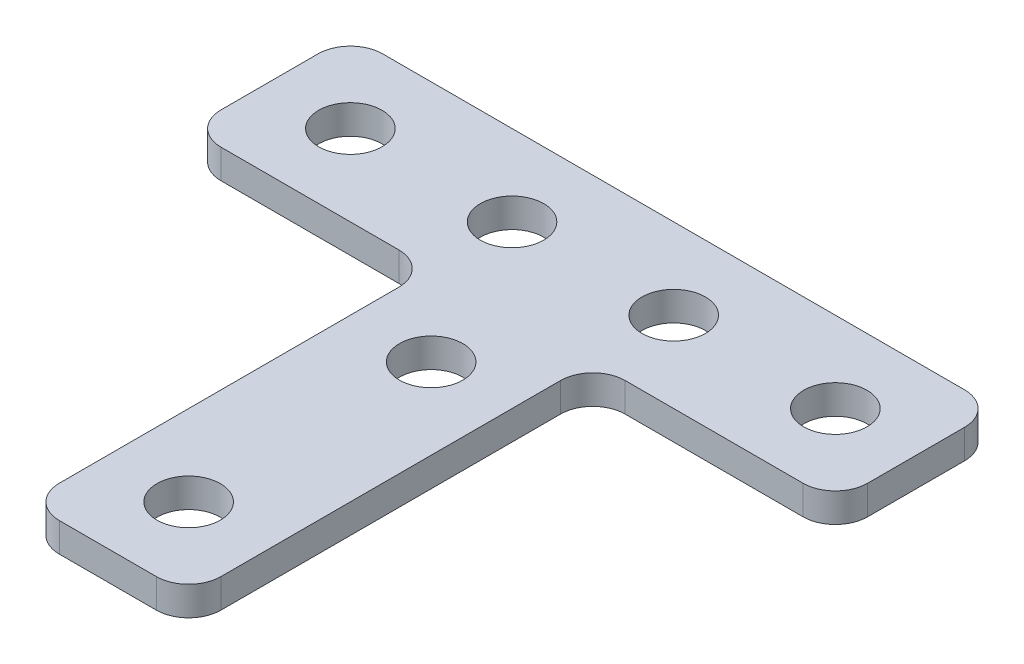
ISO-10303-21;
HEADER;
FILE_DESCRIPTION(('STEP AP214'),'2;1');
FILE_NAME('part.step','',(''),(''),'','','');
FILE_SCHEMA(('AUTOMOTIVE_DESIGN { 1 0 10303 214 1 1 1 1 }'));
ENDSEC;
DATA;
#1=APPLICATION_CONTEXT('core data for automotive mechanical design processes');
#2=APPLICATION_PROTOCOL_DEFINITION('international standard','automotive_design',2000,#1);
#3=PRODUCT_CONTEXT('',#1,'mechanical');
#4=PRODUCT('Part','Part','',(#3));
#5=PRODUCT_RELATED_PRODUCT_CATEGORY('part','',(#4));
#6=PRODUCT_DEFINITION_FORMATION('','',#4);
#7=PRODUCT_DEFINITION_CONTEXT('part definition',#1,'design');
#8=PRODUCT_DEFINITION('design','',#6,#7);
#9=PRODUCT_DEFINITION_SHAPE('','',#8);
#10=(LENGTH_UNIT() NAMED_UNIT(*) SI_UNIT(.MILLI.,.METRE.));
#11=(NAMED_UNIT(*) PLANE_ANGLE_UNIT() SI_UNIT($,.RADIAN.));
#12=(NAMED_UNIT(*) SI_UNIT($,.STERADIAN.) SOLID_ANGLE_UNIT());
#13=UNCERTAINTY_MEASURE_WITH_UNIT(LENGTH_MEASURE(1.E-05),#10,'distance_accuracy_value','');
#14=(GEOMETRIC_REPRESENTATION_CONTEXT(3) GLOBAL_UNCERTAINTY_ASSIGNED_CONTEXT((#13)) GLOBAL_UNIT_ASSIGNED_CONTEXT((#10,
#11,#12)) REPRESENTATION_CONTEXT('',''));
#15=CARTESIAN_POINT('',(0.,0.,0.));
#16=DIRECTION('',(0.,0.,1.));
#17=DIRECTION('',(1.,0.,0.));
#18=AXIS2_PLACEMENT_3D('',#15,#16,#17);
#19=CARTESIAN_POINT('',(0.,2.286,-31.75));
#20=DIRECTION('',(0.,0.,-1.));
#21=DIRECTION('',(-1.,0.,0.));
#22=AXIS2_PLACEMENT_3D('',#19,#20,#21);
#23=PLANE('',#22);
#24=DIRECTION('',(1.,0.,0.));
#25=VECTOR('',#24,1.);
#26=CARTESIAN_POINT('',(0.,2.286,-31.75));
#27=LINE('',#26,#25);
#28=CARTESIAN_POINT('',(-16.5071004340156,2.286,-31.75));
#29=VERTEX_POINT('',#28);
#30=CARTESIAN_POINT('',(-2.54,2.286,-31.75));
#31=VERTEX_POINT('',#30);
#32=EDGE_CURVE('E280',#29,#31,#27,.T.);
#33=ORIENTED_EDGE('',*,*,#32,.F.);
#34=DIRECTION('',(0.,-1.,0.));
#35=VECTOR('',#34,1.);
#36=CARTESIAN_POINT('',(-16.5071004340156,0.,-31.75));
#37=LINE('',#36,#35);
#38=CARTESIAN_POINT('',(-16.5071004340156,0.,-31.75));
#39=VERTEX_POINT('',#38);
#40=EDGE_CURVE('E222',#29,#39,#37,.T.);
#41=ORIENTED_EDGE('',*,*,#40,.T.);
#42=DIRECTION('',(1.,0.,0.));
#43=VECTOR('',#42,1.);
#44=CARTESIAN_POINT('',(0.,0.,-31.75));
#45=LINE('',#44,#43);
#46=CARTESIAN_POINT('',(-2.54,0.,-31.75));
#47=VERTEX_POINT('',#46);
#48=EDGE_CURVE('E165',#39,#47,#45,.T.);
#49=ORIENTED_EDGE('',*,*,#48,.T.);
#50=DIRECTION('',(0.,-1.,0.));
#51=VECTOR('',#50,1.);
#52=CARTESIAN_POINT('',(-2.54,2.286,-31.75));
#53=LINE('',#52,#51);
#54=EDGE_CURVE('E220',#47,#31,#53,.F.);
#55=ORIENTED_EDGE('',*,*,#54,.T.);
#56=EDGE_LOOP('',(#33,#41,#49,#55));
#57=FACE_BOUND('',#56,.T.);
#58=ADVANCED_FACE('F45',(#57),#23,.F.);
#59=CARTESIAN_POINT('',(0.,2.286,0.));
#60=DIRECTION('',(-1.,0.,0.));
#61=DIRECTION('',(0.,0.,1.));
#62=AXIS2_PLACEMENT_3D('',#59,#60,#61);
#63=PLANE('',#62);
#64=DIRECTION('',(0.,0.,-1.));
#65=VECTOR('',#64,1.);
#66=CARTESIAN_POINT('',(0.,2.286,0.));
#67=LINE('',#66,#65);
#68=CARTESIAN_POINT('',(0.,2.286,-2.54));
#69=VERTEX_POINT('',#68);
#70=CARTESIAN_POINT('',(0.,2.286,-29.21));
#71=VERTEX_POINT('',#70);
#72=EDGE_CURVE('E288',#69,#71,#67,.T.);
#73=ORIENTED_EDGE('',*,*,#72,.T.);
#74=DIRECTION('',(0.,-1.,0.));
#75=VECTOR('',#74,1.);
#76=CARTESIAN_POINT('',(0.,2.286,-29.21));
#77=LINE('',#76,#75);
#78=CARTESIAN_POINT('',(0.,0.,-29.21));
#79=VERTEX_POINT('',#78);
#80=EDGE_CURVE('E226',#71,#79,#77,.T.);
#81=ORIENTED_EDGE('',*,*,#80,.T.);
#82=DIRECTION('',(0.,0.,-1.));
#83=VECTOR('',#82,1.);
#84=CARTESIAN_POINT('',(0.,0.,0.));
#85=LINE('',#84,#83);
#86=CARTESIAN_POINT('',(0.,0.,-2.54));
#87=VERTEX_POINT('',#86);
#88=EDGE_CURVE('E319',#87,#79,#85,.T.);
#89=ORIENTED_EDGE('',*,*,#88,.F.);
#90=DIRECTION('',(0.,-1.,0.));
#91=VECTOR('',#90,1.);
#92=CARTESIAN_POINT('',(0.,2.286,-2.54));
#93=LINE('',#92,#91);
#94=EDGE_CURVE('E224',#87,#69,#93,.F.);
#95=ORIENTED_EDGE('',*,*,#94,.T.);
#96=EDGE_LOOP('',(#73,#81,#89,#95));
#97=FACE_BOUND('',#96,.T.);
#98=ADVANCED_FACE('F357',(#97),#63,.T.);
#99=CARTESIAN_POINT('',(0.,2.286,0.));
#100=DIRECTION('',(0.,0.,-1.));
#101=DIRECTION('',(-1.,0.,0.));
#102=AXIS2_PLACEMENT_3D('',#99,#100,#101);
#103=PLANE('',#102);
#104=DIRECTION('',(1.,0.,0.));
#105=VECTOR('',#104,1.);
#106=CARTESIAN_POINT('',(0.,2.286,0.));
#107=LINE('',#106,#105);
#108=CARTESIAN_POINT('',(2.54,2.286,0.));
#109=VERTEX_POINT('',#108);
#110=CARTESIAN_POINT('',(10.16,2.286,0.));
#111=VERTEX_POINT('',#110);
#112=EDGE_CURVE('E283',#109,#111,#107,.T.);
#113=ORIENTED_EDGE('',*,*,#112,.F.);
#114=DIRECTION('',(0.,-1.,0.));
#115=VECTOR('',#114,1.);
#116=CARTESIAN_POINT('',(2.54,0.,0.));
#117=LINE('',#116,#115);
#118=CARTESIAN_POINT('',(2.54,0.,0.));
#119=VERTEX_POINT('',#118);
#120=EDGE_CURVE('E245',#109,#119,#117,.T.);
#121=ORIENTED_EDGE('',*,*,#120,.T.);
#122=DIRECTION('',(1.,0.,0.));
#123=VECTOR('',#122,1.);
#124=CARTESIAN_POINT('',(0.,0.,0.));
#125=LINE('',#124,#123);
#126=CARTESIAN_POINT('',(10.16,0.,0.));
#127=VERTEX_POINT('',#126);
#128=EDGE_CURVE('E265',#119,#127,#125,.T.);
#129=ORIENTED_EDGE('',*,*,#128,.T.);
#130=DIRECTION('',(0.,-1.,0.));
#131=VECTOR('',#130,1.);
#132=CARTESIAN_POINT('',(10.16,2.286,0.));
#133=LINE('',#132,#131);
#134=EDGE_CURVE('E243',#127,#111,#133,.F.);
#135=ORIENTED_EDGE('',*,*,#134,.T.);
#136=EDGE_LOOP('',(#113,#121,#129,#135));
#137=FACE_BOUND('',#136,.T.);
#138=ADVANCED_FACE('F351',(#137),#103,.F.);
#139=CARTESIAN_POINT('',(12.7,2.286,0.));
#140=DIRECTION('',(-1.,0.,0.));
#141=DIRECTION('',(0.,0.,1.));
#142=AXIS2_PLACEMENT_3D('',#139,#140,#141);
#143=PLANE('',#142);
#144=DIRECTION('',(0.,0.,-1.));
#145=VECTOR('',#144,1.);
#146=CARTESIAN_POINT('',(12.7,0.,0.));
#147=LINE('',#146,#145);
#148=CARTESIAN_POINT('',(12.7,0.,-2.54));
#149=VERTEX_POINT('',#148);
#150=CARTESIAN_POINT('',(12.7,0.,-29.21));
#151=VERTEX_POINT('',#150);
#152=EDGE_CURVE('E254',#149,#151,#147,.T.);
#153=ORIENTED_EDGE('',*,*,#152,.T.);
#154=DIRECTION('',(0.,-1.,0.));
#155=VECTOR('',#154,1.);
#156=CARTESIAN_POINT('',(12.7,2.286,-29.21));
#157=LINE('',#156,#155);
#158=CARTESIAN_POINT('',(12.7,2.286,-29.21));
#159=VERTEX_POINT('',#158);
#160=EDGE_CURVE('E241',#151,#159,#157,.F.);
#161=ORIENTED_EDGE('',*,*,#160,.T.);
#162=DIRECTION('',(0.,0.,-1.));
#163=VECTOR('',#162,1.);
#164=CARTESIAN_POINT('',(12.7,2.286,0.));
#165=LINE('',#164,#163);
#166=CARTESIAN_POINT('',(12.7,2.286,-2.54));
#167=VERTEX_POINT('',#166);
#168=EDGE_CURVE('E274',#167,#159,#165,.T.);
#169=ORIENTED_EDGE('',*,*,#168,.F.);
#170=DIRECTION('',(0.,-1.,0.));
#171=VECTOR('',#170,1.);
#172=CARTESIAN_POINT('',(12.7,2.286,-2.54));
#173=LINE('',#172,#171);
#174=EDGE_CURVE('E238',#167,#149,#173,.T.);
#175=ORIENTED_EDGE('',*,*,#174,.T.);
#176=EDGE_LOOP('',(#153,#161,#169,#175));
#177=FACE_BOUND('',#176,.T.);
#178=ADVANCED_FACE('F261',(#177),#143,.F.);
#179=CARTESIAN_POINT('',(15.24,0.,-31.75));
#180=VERTEX_POINT('',#179);
#181=CARTESIAN_POINT('',(29.21,0.,-31.75));
#182=VERTEX_POINT('',#181);
#183=EDGE_CURVE('E256',#180,#182,#45,.T.);
#184=ORIENTED_EDGE('',*,*,#183,.T.);
#185=DIRECTION('',(0.,-1.,0.));
#186=VECTOR('',#185,1.);
#187=CARTESIAN_POINT('',(29.21,2.286,-31.75));
#188=LINE('',#187,#186);
#189=CARTESIAN_POINT('',(29.21,2.286,-31.75));
#190=VERTEX_POINT('',#189);
#191=EDGE_CURVE('E236',#182,#190,#188,.F.);
#192=ORIENTED_EDGE('',*,*,#191,.T.);
#193=CARTESIAN_POINT('',(15.24,2.286,-31.75));
#194=VERTEX_POINT('',#193);
#195=EDGE_CURVE('E273',#194,#190,#27,.T.);
#196=ORIENTED_EDGE('',*,*,#195,.F.);
#197=DIRECTION('',(0.,-1.,0.));
#198=VECTOR('',#197,1.);
#199=CARTESIAN_POINT('',(15.24,0.,-31.75));
#200=LINE('',#199,#198);
#201=EDGE_CURVE('E233',#194,#180,#200,.T.);
#202=ORIENTED_EDGE('',*,*,#201,.T.);
#203=EDGE_LOOP('',(#184,#192,#196,#202));
#204=FACE_BOUND('',#203,.T.);
#205=ADVANCED_FACE('F276',(#204),#23,.F.);
#206=CARTESIAN_POINT('',(31.75,2.286,0.));
#207=DIRECTION('',(-1.,0.,0.));
#208=DIRECTION('',(0.,0.,1.));
#209=AXIS2_PLACEMENT_3D('',#206,#207,#208);
#210=PLANE('',#209);
#211=DIRECTION('',(0.,0.,-1.));
#212=VECTOR('',#211,1.);
#213=CARTESIAN_POINT('',(31.75,0.,0.));
#214=LINE('',#213,#212);
#215=CARTESIAN_POINT('',(31.75,0.,-34.29));
#216=VERTEX_POINT('',#215);
#217=CARTESIAN_POINT('',(31.75,0.,-41.91));
#218=VERTEX_POINT('',#217);
#219=EDGE_CURVE('E315',#216,#218,#214,.T.);
#220=ORIENTED_EDGE('',*,*,#219,.T.);
#221=DIRECTION('',(0.,-1.,0.));
#222=VECTOR('',#221,1.);
#223=CARTESIAN_POINT('',(31.75,2.286,-41.91));
#224=LINE('',#223,#222);
#225=CARTESIAN_POINT('',(31.75,2.286,-41.91));
#226=VERTEX_POINT('',#225);
#227=EDGE_CURVE('E60',#218,#226,#224,.F.);
#228=ORIENTED_EDGE('',*,*,#227,.T.);
#229=DIRECTION('',(0.,0.,-1.));
#230=VECTOR('',#229,1.);
#231=CARTESIAN_POINT('',(31.75,2.286,0.));
#232=LINE('',#231,#230);
#233=CARTESIAN_POINT('',(31.75,2.286,-34.29));
#234=VERTEX_POINT('',#233);
#235=EDGE_CURVE('E278',#234,#226,#232,.T.);
#236=ORIENTED_EDGE('',*,*,#235,.F.);
#237=DIRECTION('',(0.,-1.,0.));
#238=VECTOR('',#237,1.);
#239=CARTESIAN_POINT('',(31.75,2.286,-34.29));
#240=LINE('',#239,#238);
#241=EDGE_CURVE('E229',#234,#216,#240,.T.);
#242=ORIENTED_EDGE('',*,*,#241,.T.);
#243=EDGE_LOOP('',(#220,#228,#236,#242));
#244=FACE_BOUND('',#243,.T.);
#245=ADVANCED_FACE('F373',(#244),#210,.F.);
#246=CARTESIAN_POINT('',(0.,2.286,-44.45));
#247=DIRECTION('',(0.,0.,-1.));
#248=DIRECTION('',(-1.,0.,0.));
#249=AXIS2_PLACEMENT_3D('',#246,#247,#248);
#250=PLANE('',#249);
#251=DIRECTION('',(1.,0.,0.));
#252=VECTOR('',#251,1.);
#253=CARTESIAN_POINT('',(0.,0.,-44.45));
#254=LINE('',#253,#252);
#255=CARTESIAN_POINT('',(-16.5071004340156,0.,-44.45));
#256=VERTEX_POINT('',#255);
#257=CARTESIAN_POINT('',(29.21,0.,-44.45));
#258=VERTEX_POINT('',#257);
#259=EDGE_CURVE('E182',#256,#258,#254,.T.);
#260=ORIENTED_EDGE('',*,*,#259,.F.);
#261=DIRECTION('',(0.,-1.,0.));
#262=VECTOR('',#261,1.);
#263=CARTESIAN_POINT('',(-16.5071004340156,2.286,-44.45));
#264=LINE('',#263,#262);
#265=CARTESIAN_POINT('',(-16.5071004340156,2.286,-44.45));
#266=VERTEX_POINT('',#265);
#267=EDGE_CURVE('E208',#256,#266,#264,.F.);
#268=ORIENTED_EDGE('',*,*,#267,.T.);
#269=DIRECTION('',(1.,0.,0.));
#270=VECTOR('',#269,1.);
#271=CARTESIAN_POINT('',(0.,2.286,-44.45));
#272=LINE('',#271,#270);
#273=CARTESIAN_POINT('',(29.21,2.286,-44.45));
#274=VERTEX_POINT('',#273);
#275=EDGE_CURVE('E281',#266,#274,#272,.T.);
#276=ORIENTED_EDGE('',*,*,#275,.T.);
#277=DIRECTION('',(0.,-1.,0.));
#278=VECTOR('',#277,1.);
#279=CARTESIAN_POINT('',(29.21,0.,-44.45));
#280=LINE('',#279,#278);
#281=EDGE_CURVE('E205',#274,#258,#280,.T.);
#282=ORIENTED_EDGE('',*,*,#281,.T.);
#283=EDGE_LOOP('',(#260,#268,#276,#282));
#284=FACE_BOUND('',#283,.T.);
#285=ADVANCED_FACE('F378',(#284),#250,.T.);
#286=CARTESIAN_POINT('',(6.35,2.286,-25.4));
#287=DIRECTION('',(0.,-1.,0.));
#288=DIRECTION('',(0.,0.,-1.));
#289=AXIS2_PLACEMENT_3D('',#286,#287,#288);
#290=CYLINDRICAL_SURFACE('',#289,2.4892);
#291=CARTESIAN_POINT('',(6.35,2.286,-25.4));
#292=DIRECTION('',(0.,1.,0.));
#293=DIRECTION('',(0.,0.,1.));
#294=AXIS2_PLACEMENT_3D('',#291,#292,#293);
#295=CIRCLE('',#294,2.4892);
#296=CARTESIAN_POINT('',(6.35,2.286,-22.9108));
#297=VERTEX_POINT('',#296);
#298=EDGE_CURVE('E192',#297,#297,#295,.T.);
#299=ORIENTED_EDGE('',*,*,#298,.T.);
#300=EDGE_LOOP('',(#299));
#301=FACE_BOUND('',#300,.T.);
#302=CARTESIAN_POINT('',(6.35,0.,-25.4));
#303=DIRECTION('',(0.,1.,0.));
#304=DIRECTION('',(0.,0.,1.));
#305=AXIS2_PLACEMENT_3D('',#302,#303,#304);
#306=CIRCLE('',#305,2.4892);
#307=CARTESIAN_POINT('',(6.35,0.,-22.9108));
#308=VERTEX_POINT('',#307);
#309=EDGE_CURVE('E181',#308,#308,#306,.T.);
#310=ORIENTED_EDGE('',*,*,#309,.F.);
#311=EDGE_LOOP('',(#310));
#312=FACE_BOUND('',#311,.T.);
#313=ADVANCED_FACE('F489',(#301,#312),#290,.F.);
#314=CARTESIAN_POINT('',(-19.0471004340156,2.286,0.));
#315=DIRECTION('',(-1.,0.,0.));
#316=DIRECTION('',(0.,0.,1.));
#317=AXIS2_PLACEMENT_3D('',#314,#315,#316);
#318=PLANE('',#317);
#319=DIRECTION('',(0.,0.,-1.));
#320=VECTOR('',#319,1.);
#321=CARTESIAN_POINT('',(-19.0471004340156,2.286,0.));
#322=LINE('',#321,#320);
#323=CARTESIAN_POINT('',(-19.0471004340156,2.286,-34.29));
#324=VERTEX_POINT('',#323);
#325=CARTESIAN_POINT('',(-19.0471004340156,2.286,-41.91));
#326=VERTEX_POINT('',#325);
#327=EDGE_CURVE('E337',#324,#326,#322,.T.);
#328=ORIENTED_EDGE('',*,*,#327,.T.);
#329=DIRECTION('',(0.,-1.,0.));
#330=VECTOR('',#329,1.);
#331=CARTESIAN_POINT('',(-19.0471004340156,2.286,-41.91));
#332=LINE('',#331,#330);
#333=CARTESIAN_POINT('',(-19.0471004340156,0.,-41.91));
#334=VERTEX_POINT('',#333);
#335=EDGE_CURVE('E180',#326,#334,#332,.T.);
#336=ORIENTED_EDGE('',*,*,#335,.T.);
#337=DIRECTION('',(0.,0.,-1.));
#338=VECTOR('',#337,1.);
#339=CARTESIAN_POINT('',(-19.0471004340156,0.,0.));
#340=LINE('',#339,#338);
#341=CARTESIAN_POINT('',(-19.0471004340156,0.,-34.29));
#342=VERTEX_POINT('',#341);
#343=EDGE_CURVE('E163',#342,#334,#340,.T.);
#344=ORIENTED_EDGE('',*,*,#343,.F.);
#345=DIRECTION('',(0.,-1.,0.));
#346=VECTOR('',#345,1.);
#347=CARTESIAN_POINT('',(-19.0471004340156,2.286,-34.29));
#348=LINE('',#347,#346);
#349=EDGE_CURVE('E177',#342,#324,#348,.F.);
#350=ORIENTED_EDGE('',*,*,#349,.T.);
#351=EDGE_LOOP('',(#328,#336,#344,#350));
#352=FACE_BOUND('',#351,.T.);
#353=ADVANCED_FACE('F176',(#352),#318,.T.);
#354=CARTESIAN_POINT('',(0.00289956598443879,2.286,-38.1));
#355=DIRECTION('',(0.,-1.,0.));
#356=DIRECTION('',(0.,0.,-1.));
#357=AXIS2_PLACEMENT_3D('',#354,#355,#356);
#358=CYLINDRICAL_SURFACE('',#357,2.48920000000001);
#359=CARTESIAN_POINT('',(0.00289956598443879,2.286,-38.1));
#360=DIRECTION('',(0.,1.,0.));
#361=DIRECTION('',(0.,0.,1.));
#362=AXIS2_PLACEMENT_3D('',#359,#360,#361);
#363=CIRCLE('',#362,2.48920000000001);
#364=CARTESIAN_POINT('',(0.00289956598443879,2.286,-35.6108));
#365=VERTEX_POINT('',#364);
#366=EDGE_CURVE('E289',#365,#365,#363,.T.);
#367=ORIENTED_EDGE('',*,*,#366,.T.);
#368=EDGE_LOOP('',(#367));
#369=FACE_BOUND('',#368,.T.);
#370=CARTESIAN_POINT('',(0.00289956598443879,0.,-38.1));
#371=DIRECTION('',(0.,1.,0.));
#372=DIRECTION('',(0.,0.,1.));
#373=AXIS2_PLACEMENT_3D('',#370,#371,#372);
#374=CIRCLE('',#373,2.48920000000001);
#375=CARTESIAN_POINT('',(0.00289956598443879,0.,-35.6108));
#376=VERTEX_POINT('',#375);
#377=EDGE_CURVE('E323',#376,#376,#374,.T.);
#378=ORIENTED_EDGE('',*,*,#377,.F.);
#379=EDGE_LOOP('',(#378));
#380=FACE_BOUND('',#379,.T.);
#381=ADVANCED_FACE('F384',(#369,#380),#358,.F.);
#382=CARTESIAN_POINT('',(12.7028995659844,2.286,-38.0999999999997));
#383=DIRECTION('',(0.,-1.,0.));
#384=DIRECTION('',(0.,0.,-1.));
#385=AXIS2_PLACEMENT_3D('',#382,#383,#384);
#386=CYLINDRICAL_SURFACE('',#385,2.4892);
#387=CARTESIAN_POINT('',(12.7028995659844,2.286,-38.0999999999997));
#388=DIRECTION('',(0.,1.,0.));
#389=DIRECTION('',(0.,0.,1.));
#390=AXIS2_PLACEMENT_3D('',#387,#388,#389);
#391=CIRCLE('',#390,2.4892);
#392=CARTESIAN_POINT('',(12.7028995659844,2.286,-35.6107999999997));
#393=VERTEX_POINT('',#392);
#394=EDGE_CURVE('E294',#393,#393,#391,.T.);
#395=ORIENTED_EDGE('',*,*,#394,.T.);
#396=EDGE_LOOP('',(#395));
#397=FACE_BOUND('',#396,.T.);
#398=CARTESIAN_POINT('',(12.7028995659844,0.,-38.0999999999997));
#399=DIRECTION('',(0.,1.,0.));
#400=DIRECTION('',(0.,0.,1.));
#401=AXIS2_PLACEMENT_3D('',#398,#399,#400);
#402=CIRCLE('',#401,2.4892);
#403=CARTESIAN_POINT('',(12.7028995659844,0.,-35.6107999999997));
#404=VERTEX_POINT('',#403);
#405=EDGE_CURVE('E326',#404,#404,#402,.T.);
#406=ORIENTED_EDGE('',*,*,#405,.F.);
#407=EDGE_LOOP('',(#406));
#408=FACE_BOUND('',#407,.T.);
#409=ADVANCED_FACE('F387',(#397,#408),#386,.F.);
#410=CARTESIAN_POINT('',(25.4,2.286,-38.1));
#411=DIRECTION('',(0.,-1.,0.));
#412=DIRECTION('',(0.,0.,-1.));
#413=AXIS2_PLACEMENT_3D('',#410,#411,#412);
#414=CYLINDRICAL_SURFACE('',#413,2.4892);
#415=CARTESIAN_POINT('',(25.4,2.286,-38.1));
#416=DIRECTION('',(0.,1.,0.));
#417=DIRECTION('',(0.,0.,1.));
#418=AXIS2_PLACEMENT_3D('',#415,#416,#417);
#419=CIRCLE('',#418,2.4892);
#420=CARTESIAN_POINT('',(25.4,2.286,-35.6108));
#421=VERTEX_POINT('',#420);
#422=EDGE_CURVE('E298',#421,#421,#419,.T.);
#423=ORIENTED_EDGE('',*,*,#422,.T.);
#424=EDGE_LOOP('',(#423));
#425=FACE_BOUND('',#424,.T.);
#426=CARTESIAN_POINT('',(25.4,0.,-38.1));
#427=DIRECTION('',(0.,1.,0.));
#428=DIRECTION('',(0.,0.,1.));
#429=AXIS2_PLACEMENT_3D('',#426,#427,#428);
#430=CIRCLE('',#429,2.4892);
#431=CARTESIAN_POINT('',(25.4,0.,-35.6108));
#432=VERTEX_POINT('',#431);
#433=EDGE_CURVE('E329',#432,#432,#430,.T.);
#434=ORIENTED_EDGE('',*,*,#433,.F.);
#435=EDGE_LOOP('',(#434));
#436=FACE_BOUND('',#435,.T.);
#437=ADVANCED_FACE('F390',(#425,#436),#414,.F.);
#438=CARTESIAN_POINT('',(-12.6971004340156,2.286,-38.1));
#439=DIRECTION('',(0.,-1.,0.));
#440=DIRECTION('',(0.,0.,-1.));
#441=AXIS2_PLACEMENT_3D('',#438,#439,#440);
#442=CYLINDRICAL_SURFACE('',#441,2.4892);
#443=CARTESIAN_POINT('',(-12.6971004340156,2.286,-38.1));
#444=DIRECTION('',(0.,1.,0.));
#445=DIRECTION('',(0.,0.,1.));
#446=AXIS2_PLACEMENT_3D('',#443,#444,#445);
#447=CIRCLE('',#446,2.4892);
#448=CARTESIAN_POINT('',(-12.6971004340156,2.286,-35.6108));
#449=VERTEX_POINT('',#448);
#450=EDGE_CURVE('E303',#449,#449,#447,.T.);
#451=ORIENTED_EDGE('',*,*,#450,.T.);
#452=EDGE_LOOP('',(#451));
#453=FACE_BOUND('',#452,.T.);
#454=CARTESIAN_POINT('',(-12.6971004340156,0.,-38.1));
#455=DIRECTION('',(0.,1.,0.));
#456=DIRECTION('',(0.,0.,1.));
#457=AXIS2_PLACEMENT_3D('',#454,#455,#456);
#458=CIRCLE('',#457,2.4892);
#459=CARTESIAN_POINT('',(-12.6971004340156,0.,-35.6108));
#460=VERTEX_POINT('',#459);
#461=EDGE_CURVE('E332',#460,#460,#458,.T.);
#462=ORIENTED_EDGE('',*,*,#461,.F.);
#463=EDGE_LOOP('',(#462));
#464=FACE_BOUND('',#463,.T.);
#465=ADVANCED_FACE('F394',(#453,#464),#442,.F.);
#466=CARTESIAN_POINT('',(6.35,2.286,-6.35));
#467=DIRECTION('',(0.,-1.,0.));
#468=DIRECTION('',(0.,0.,-1.));
#469=AXIS2_PLACEMENT_3D('',#466,#467,#468);
#470=CYLINDRICAL_SURFACE('',#469,2.4892);
#471=CARTESIAN_POINT('',(6.35,2.286,-6.35));
#472=DIRECTION('',(0.,1.,0.));
#473=DIRECTION('',(0.,0.,1.));
#474=AXIS2_PLACEMENT_3D('',#471,#472,#473);
#475=CIRCLE('',#474,2.4892);
#476=CARTESIAN_POINT('',(6.35,2.286,-3.8608));
#477=VERTEX_POINT('',#476);
#478=EDGE_CURVE('E187',#477,#477,#475,.T.);
#479=ORIENTED_EDGE('',*,*,#478,.T.);
#480=EDGE_LOOP('',(#479));
#481=FACE_BOUND('',#480,.T.);
#482=CARTESIAN_POINT('',(6.35,0.,-6.35));
#483=DIRECTION('',(0.,1.,0.));
#484=DIRECTION('',(0.,0.,1.));
#485=AXIS2_PLACEMENT_3D('',#482,#483,#484);
#486=CIRCLE('',#485,2.4892);
#487=CARTESIAN_POINT('',(6.35,0.,-3.8608));
#488=VERTEX_POINT('',#487);
#489=EDGE_CURVE('E195',#488,#488,#486,.T.);
#490=ORIENTED_EDGE('',*,*,#489,.F.);
#491=EDGE_LOOP('',(#490));
#492=FACE_BOUND('',#491,.T.);
#493=ADVANCED_FACE('F398',(#481,#492),#470,.F.);
#494=CARTESIAN_POINT('',(0.,2.286,0.));
#495=DIRECTION('',(0.,1.,0.));
#496=DIRECTION('',(0.,0.,1.));
#497=AXIS2_PLACEMENT_3D('',#494,#495,#496);
#498=PLANE('',#497);
#499=ORIENTED_EDGE('',*,*,#450,.F.);
#500=EDGE_LOOP('',(#499));
#501=FACE_BOUND('',#500,.T.);
#502=ORIENTED_EDGE('',*,*,#422,.F.);
#503=EDGE_LOOP('',(#502));
#504=FACE_BOUND('',#503,.T.);
#505=ORIENTED_EDGE('',*,*,#394,.F.);
#506=EDGE_LOOP('',(#505));
#507=FACE_BOUND('',#506,.T.);
#508=ORIENTED_EDGE('',*,*,#366,.F.);
#509=EDGE_LOOP('',(#508));
#510=FACE_BOUND('',#509,.T.);
#511=ORIENTED_EDGE('',*,*,#275,.F.);
#512=CARTESIAN_POINT('',(-16.5071004340156,2.286,-41.91));
#513=DIRECTION('',(0.,1.,0.));
#514=DIRECTION('',(0.,0.,1.));
#515=AXIS2_PLACEMENT_3D('',#512,#513,#514);
#516=CIRCLE('',#515,2.54);
#517=EDGE_CURVE('E218',#266,#326,#516,.T.);
#518=ORIENTED_EDGE('',*,*,#517,.T.);
#519=ORIENTED_EDGE('',*,*,#327,.F.);
#520=CARTESIAN_POINT('',(-16.5071004340156,2.286,-34.29));
#521=DIRECTION('',(0.,1.,0.));
#522=DIRECTION('',(0.,0.,1.));
#523=AXIS2_PLACEMENT_3D('',#520,#521,#522);
#524=CIRCLE('',#523,2.54);
#525=EDGE_CURVE('E186',#324,#29,#524,.T.);
#526=ORIENTED_EDGE('',*,*,#525,.T.);
#527=ORIENTED_EDGE('',*,*,#32,.T.);
#528=CARTESIAN_POINT('',(-2.54,2.286,-29.21));
#529=DIRECTION('',(0.,1.,0.));
#530=DIRECTION('',(0.,0.,1.));
#531=AXIS2_PLACEMENT_3D('',#528,#529,#530);
#532=CIRCLE('',#531,2.54);
#533=EDGE_CURVE('E250',#31,#71,#532,.F.);
#534=ORIENTED_EDGE('',*,*,#533,.T.);
#535=ORIENTED_EDGE('',*,*,#72,.F.);
#536=CARTESIAN_POINT('',(2.54,2.286,-2.54));
#537=DIRECTION('',(0.,1.,0.));
#538=DIRECTION('',(0.,0.,1.));
#539=AXIS2_PLACEMENT_3D('',#536,#537,#538);
#540=CIRCLE('',#539,2.54);
#541=EDGE_CURVE('E212',#69,#109,#540,.T.);
#542=ORIENTED_EDGE('',*,*,#541,.T.);
#543=ORIENTED_EDGE('',*,*,#112,.T.);
#544=CARTESIAN_POINT('',(10.16,2.286,-2.54));
#545=DIRECTION('',(0.,1.,0.));
#546=DIRECTION('',(0.,0.,1.));
#547=AXIS2_PLACEMENT_3D('',#544,#545,#546);
#548=CIRCLE('',#547,2.54);
#549=EDGE_CURVE('E210',#111,#167,#548,.T.);
#550=ORIENTED_EDGE('',*,*,#549,.T.);
#551=ORIENTED_EDGE('',*,*,#168,.T.);
#552=CARTESIAN_POINT('',(15.24,2.286,-29.21));
#553=DIRECTION('',(0.,1.,0.));
#554=DIRECTION('',(0.,0.,1.));
#555=AXIS2_PLACEMENT_3D('',#552,#553,#554);
#556=CIRCLE('',#555,2.54);
#557=EDGE_CURVE('E11',#159,#194,#556,.F.);
#558=ORIENTED_EDGE('',*,*,#557,.T.);
#559=ORIENTED_EDGE('',*,*,#195,.T.);
#560=CARTESIAN_POINT('',(29.21,2.286,-34.29));
#561=DIRECTION('',(0.,1.,0.));
#562=DIRECTION('',(0.,0.,1.));
#563=AXIS2_PLACEMENT_3D('',#560,#561,#562);
#564=CIRCLE('',#563,2.54);
#565=EDGE_CURVE('E67',#190,#234,#564,.T.);
#566=ORIENTED_EDGE('',*,*,#565,.T.);
#567=ORIENTED_EDGE('',*,*,#235,.T.);
#568=CARTESIAN_POINT('',(29.21,2.286,-41.91));
#569=DIRECTION('',(0.,1.,0.));
#570=DIRECTION('',(0.,0.,1.));
#571=AXIS2_PLACEMENT_3D('',#568,#569,#570);
#572=CIRCLE('',#571,2.54);
#573=EDGE_CURVE('E215',#226,#274,#572,.T.);
#574=ORIENTED_EDGE('',*,*,#573,.T.);
#575=EDGE_LOOP('',(#511,#518,#519,#526,#527,#534,#535,#542,#543,#550,#551,#558,#559,#566,#567,#574));
#576=FACE_BOUND('',#575,.T.);
#577=ORIENTED_EDGE('',*,*,#298,.F.);
#578=EDGE_LOOP('',(#577));
#579=FACE_BOUND('',#578,.T.);
#580=ORIENTED_EDGE('',*,*,#478,.F.);
#581=EDGE_LOOP('',(#580));
#582=FACE_BOUND('',#581,.T.);
#583=ADVANCED_FACE('F271',(#501,#504,#507,#510,#576,#579,#582),#498,.T.);
#584=CARTESIAN_POINT('',(0.,0.,0.));
#585=DIRECTION('',(0.,1.,0.));
#586=DIRECTION('',(0.,0.,1.));
#587=AXIS2_PLACEMENT_3D('',#584,#585,#586);
#588=PLANE('',#587);
#589=ORIENTED_EDGE('',*,*,#461,.T.);
#590=EDGE_LOOP('',(#589));
#591=FACE_BOUND('',#590,.T.);
#592=ORIENTED_EDGE('',*,*,#433,.T.);
#593=EDGE_LOOP('',(#592));
#594=FACE_BOUND('',#593,.T.);
#595=ORIENTED_EDGE('',*,*,#405,.T.);
#596=EDGE_LOOP('',(#595));
#597=FACE_BOUND('',#596,.T.);
#598=ORIENTED_EDGE('',*,*,#377,.T.);
#599=EDGE_LOOP('',(#598));
#600=FACE_BOUND('',#599,.T.);
#601=ORIENTED_EDGE('',*,*,#343,.T.);
#602=CARTESIAN_POINT('',(-16.5071004340156,0.,-41.91));
#603=DIRECTION('',(0.,1.,0.));
#604=DIRECTION('',(0.,0.,1.));
#605=AXIS2_PLACEMENT_3D('',#602,#603,#604);
#606=CIRCLE('',#605,2.54);
#607=EDGE_CURVE('E170',#334,#256,#606,.F.);
#608=ORIENTED_EDGE('',*,*,#607,.T.);
#609=ORIENTED_EDGE('',*,*,#259,.T.);
#610=CARTESIAN_POINT('',(29.21,0.,-41.91));
#611=DIRECTION('',(0.,1.,0.));
#612=DIRECTION('',(0.,0.,1.));
#613=AXIS2_PLACEMENT_3D('',#610,#611,#612);
#614=CIRCLE('',#613,2.54);
#615=EDGE_CURVE('E171',#258,#218,#614,.F.);
#616=ORIENTED_EDGE('',*,*,#615,.T.);
#617=ORIENTED_EDGE('',*,*,#219,.F.);
#618=CARTESIAN_POINT('',(29.21,0.,-34.29));
#619=DIRECTION('',(0.,1.,0.));
#620=DIRECTION('',(0.,0.,1.));
#621=AXIS2_PLACEMENT_3D('',#618,#619,#620);
#622=CIRCLE('',#621,2.54);
#623=EDGE_CURVE('E201',#216,#182,#622,.F.);
#624=ORIENTED_EDGE('',*,*,#623,.T.);
#625=ORIENTED_EDGE('',*,*,#183,.F.);
#626=CARTESIAN_POINT('',(15.24,0.,-29.21));
#627=DIRECTION('',(0.,1.,0.));
#628=DIRECTION('',(0.,0.,1.));
#629=AXIS2_PLACEMENT_3D('',#626,#627,#628);
#630=CIRCLE('',#629,2.54);
#631=EDGE_CURVE('E53',#180,#151,#630,.T.);
#632=ORIENTED_EDGE('',*,*,#631,.T.);
#633=ORIENTED_EDGE('',*,*,#152,.F.);
#634=CARTESIAN_POINT('',(10.16,0.,-2.54));
#635=DIRECTION('',(0.,1.,0.));
#636=DIRECTION('',(0.,0.,1.));
#637=AXIS2_PLACEMENT_3D('',#634,#635,#636);
#638=CIRCLE('',#637,2.54);
#639=EDGE_CURVE('E189',#149,#127,#638,.F.);
#640=ORIENTED_EDGE('',*,*,#639,.T.);
#641=ORIENTED_EDGE('',*,*,#128,.F.);
#642=CARTESIAN_POINT('',(2.54,0.,-2.54));
#643=DIRECTION('',(0.,1.,0.));
#644=DIRECTION('',(0.,0.,1.));
#645=AXIS2_PLACEMENT_3D('',#642,#643,#644);
#646=CIRCLE('',#645,2.54);
#647=EDGE_CURVE('E199',#119,#87,#646,.F.);
#648=ORIENTED_EDGE('',*,*,#647,.T.);
#649=ORIENTED_EDGE('',*,*,#88,.T.);
#650=CARTESIAN_POINT('',(-2.54,0.,-29.21));
#651=DIRECTION('',(0.,1.,0.));
#652=DIRECTION('',(0.,0.,1.));
#653=AXIS2_PLACEMENT_3D('',#650,#651,#652);
#654=CIRCLE('',#653,2.54);
#655=EDGE_CURVE('E248',#79,#47,#654,.T.);
#656=ORIENTED_EDGE('',*,*,#655,.T.);
#657=ORIENTED_EDGE('',*,*,#48,.F.);
#658=CARTESIAN_POINT('',(-16.5071004340156,0.,-34.29));
#659=DIRECTION('',(0.,1.,0.));
#660=DIRECTION('',(0.,0.,1.));
#661=AXIS2_PLACEMENT_3D('',#658,#659,#660);
#662=CIRCLE('',#661,2.54);
#663=EDGE_CURVE('E159',#39,#342,#662,.F.);
#664=ORIENTED_EDGE('',*,*,#663,.T.);
#665=EDGE_LOOP('',(#601,#608,#609,#616,#617,#624,#625,#632,#633,#640,#641,#648,#649,#656,#657,#664));
#666=FACE_BOUND('',#665,.T.);
#667=ORIENTED_EDGE('',*,*,#309,.T.);
#668=EDGE_LOOP('',(#667));
#669=FACE_BOUND('',#668,.T.);
#670=ORIENTED_EDGE('',*,*,#489,.T.);
#671=EDGE_LOOP('',(#670));
#672=FACE_BOUND('',#671,.T.);
#673=ADVANCED_FACE('F161',(#591,#594,#597,#600,#666,#669,#672),#588,.F.);
#674=CARTESIAN_POINT('',(-16.5071004340156,2.286,-41.91));
#675=DIRECTION('',(0.,-1.,0.));
#676=DIRECTION('',(0.,0.,-1.));
#677=AXIS2_PLACEMENT_3D('',#674,#675,#676);
#678=CYLINDRICAL_SURFACE('',#677,2.54);
#679=ORIENTED_EDGE('',*,*,#517,.F.);
#680=ORIENTED_EDGE('',*,*,#267,.F.);
#681=ORIENTED_EDGE('',*,*,#607,.F.);
#682=ORIENTED_EDGE('',*,*,#335,.F.);
#683=EDGE_LOOP('',(#679,#680,#681,#682));
#684=FACE_BOUND('',#683,.T.);
#685=ADVANCED_FACE('F399',(#684),#678,.T.);
#686=CARTESIAN_POINT('',(-16.5071004340156,2.286,-34.29));
#687=DIRECTION('',(0.,1.,0.));
#688=DIRECTION('',(0.,0.,1.));
#689=AXIS2_PLACEMENT_3D('',#686,#687,#688);
#690=CYLINDRICAL_SURFACE('',#689,2.54);
#691=ORIENTED_EDGE('',*,*,#525,.F.);
#692=ORIENTED_EDGE('',*,*,#349,.F.);
#693=ORIENTED_EDGE('',*,*,#663,.F.);
#694=ORIENTED_EDGE('',*,*,#40,.F.);
#695=EDGE_LOOP('',(#691,#692,#693,#694));
#696=FACE_BOUND('',#695,.T.);
#697=ADVANCED_FACE('F185',(#696),#690,.T.);
#698=CARTESIAN_POINT('',(-2.54,2.286,-29.21));
#699=DIRECTION('',(0.,-1.,0.));
#700=DIRECTION('',(0.,0.,-1.));
#701=AXIS2_PLACEMENT_3D('',#698,#699,#700);
#702=CYLINDRICAL_SURFACE('',#701,2.54);
#703=ORIENTED_EDGE('',*,*,#533,.F.);
#704=ORIENTED_EDGE('',*,*,#54,.F.);
#705=ORIENTED_EDGE('',*,*,#655,.F.);
#706=ORIENTED_EDGE('',*,*,#80,.F.);
#707=EDGE_LOOP('',(#703,#704,#705,#706));
#708=FACE_BOUND('',#707,.T.);
#709=ADVANCED_FACE('F360',(#708),#702,.F.);
#710=CARTESIAN_POINT('',(29.21,2.286,-41.91));
#711=DIRECTION('',(0.,1.,0.));
#712=DIRECTION('',(0.,0.,1.));
#713=AXIS2_PLACEMENT_3D('',#710,#711,#712);
#714=CYLINDRICAL_SURFACE('',#713,2.54);
#715=ORIENTED_EDGE('',*,*,#573,.F.);
#716=ORIENTED_EDGE('',*,*,#227,.F.);
#717=ORIENTED_EDGE('',*,*,#615,.F.);
#718=ORIENTED_EDGE('',*,*,#281,.F.);
#719=EDGE_LOOP('',(#715,#716,#717,#718));
#720=FACE_BOUND('',#719,.T.);
#721=ADVANCED_FACE('F407',(#720),#714,.T.);
#722=CARTESIAN_POINT('',(29.21,2.286,-34.29));
#723=DIRECTION('',(0.,-1.,0.));
#724=DIRECTION('',(0.,0.,-1.));
#725=AXIS2_PLACEMENT_3D('',#722,#723,#724);
#726=CYLINDRICAL_SURFACE('',#725,2.54);
#727=ORIENTED_EDGE('',*,*,#565,.F.);
#728=ORIENTED_EDGE('',*,*,#191,.F.);
#729=ORIENTED_EDGE('',*,*,#623,.F.);
#730=ORIENTED_EDGE('',*,*,#241,.F.);
#731=EDGE_LOOP('',(#727,#728,#729,#730));
#732=FACE_BOUND('',#731,.T.);
#733=ADVANCED_FACE('F410',(#732),#726,.T.);
#734=CARTESIAN_POINT('',(15.24,2.286,-29.21));
#735=DIRECTION('',(0.,1.,0.));
#736=DIRECTION('',(0.,0.,1.));
#737=AXIS2_PLACEMENT_3D('',#734,#735,#736);
#738=CYLINDRICAL_SURFACE('',#737,2.54);
#739=ORIENTED_EDGE('',*,*,#557,.F.);
#740=ORIENTED_EDGE('',*,*,#160,.F.);
#741=ORIENTED_EDGE('',*,*,#631,.F.);
#742=ORIENTED_EDGE('',*,*,#201,.F.);
#743=EDGE_LOOP('',(#739,#740,#741,#742));
#744=FACE_BOUND('',#743,.T.);
#745=ADVANCED_FACE('F268',(#744),#738,.F.);
#746=CARTESIAN_POINT('',(2.54,2.286,-2.54));
#747=DIRECTION('',(0.,1.,0.));
#748=DIRECTION('',(0.,0.,1.));
#749=AXIS2_PLACEMENT_3D('',#746,#747,#748);
#750=CYLINDRICAL_SURFACE('',#749,2.54);
#751=ORIENTED_EDGE('',*,*,#541,.F.);
#752=ORIENTED_EDGE('',*,*,#94,.F.);
#753=ORIENTED_EDGE('',*,*,#647,.F.);
#754=ORIENTED_EDGE('',*,*,#120,.F.);
#755=EDGE_LOOP('',(#751,#752,#753,#754));
#756=FACE_BOUND('',#755,.T.);
#757=ADVANCED_FACE('F353',(#756),#750,.T.);
#758=CARTESIAN_POINT('',(10.16,2.286,-2.54));
#759=DIRECTION('',(0.,-1.,0.));
#760=DIRECTION('',(0.,0.,-1.));
#761=AXIS2_PLACEMENT_3D('',#758,#759,#760);
#762=CYLINDRICAL_SURFACE('',#761,2.54);
#763=ORIENTED_EDGE('',*,*,#549,.F.);
#764=ORIENTED_EDGE('',*,*,#134,.F.);
#765=ORIENTED_EDGE('',*,*,#639,.F.);
#766=ORIENTED_EDGE('',*,*,#174,.F.);
#767=EDGE_LOOP('',(#763,#764,#765,#766));
#768=FACE_BOUND('',#767,.T.);
#769=ADVANCED_FACE('F47',(#768),#762,.T.);
#770=CLOSED_SHELL('',(#58,#98,#138,#178,#205,#245,#285,#313,#353,#381,#409,#437,#465,#493,#583,
#673,#685,#697,#709,#721,#733,#745,#757,#769));
#771=MANIFOLD_SOLID_BREP('B2',#770);
#772=ADVANCED_BREP_SHAPE_REPRESENTATION('',(#18,#771),#14);
#773=SHAPE_DEFINITION_REPRESENTATION(#9,#772);
ENDSEC;
END-ISO-10303-21;
